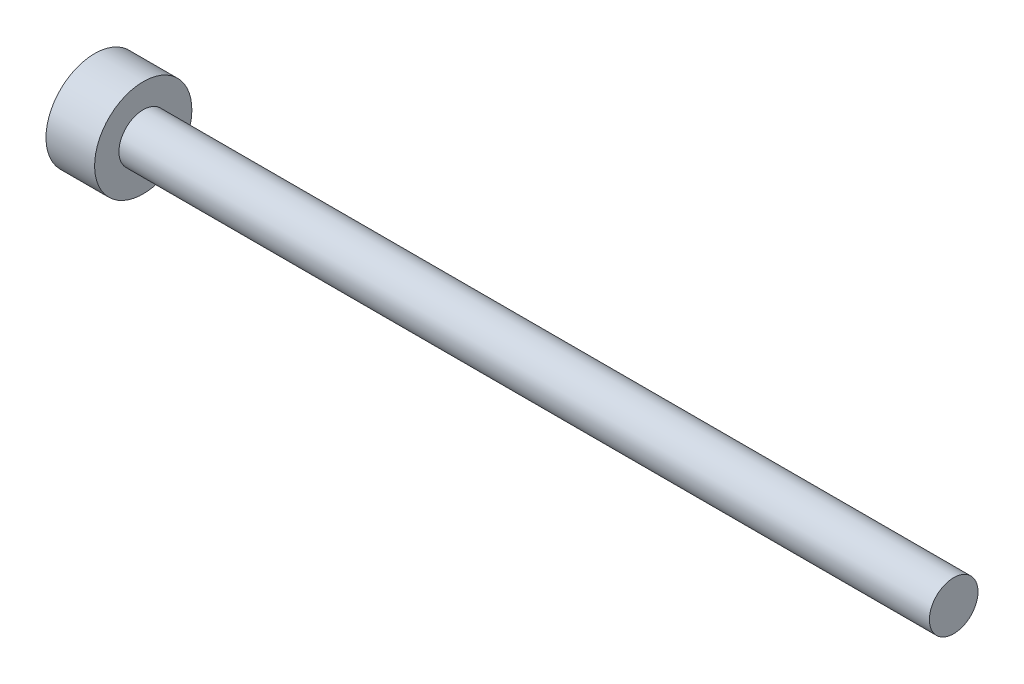
ISO-10303-21;
HEADER;
FILE_DESCRIPTION(('STEP AP214'),'2;1');
FILE_NAME('part.step','',(''),(''),'','','');
FILE_SCHEMA(('AUTOMOTIVE_DESIGN { 1 0 10303 214 1 1 1 1 }'));
ENDSEC;
DATA;
#1=APPLICATION_CONTEXT('core data for automotive mechanical design processes');
#2=APPLICATION_PROTOCOL_DEFINITION('international standard','automotive_design',2000,#1);
#3=PRODUCT_CONTEXT('',#1,'mechanical');
#4=PRODUCT('Part','Part','',(#3));
#5=PRODUCT_RELATED_PRODUCT_CATEGORY('part','',(#4));
#6=PRODUCT_DEFINITION_FORMATION('','',#4);
#7=PRODUCT_DEFINITION_CONTEXT('part definition',#1,'design');
#8=PRODUCT_DEFINITION('design','',#6,#7);
#9=PRODUCT_DEFINITION_SHAPE('','',#8);
#10=(LENGTH_UNIT() NAMED_UNIT(*) SI_UNIT(.MILLI.,.METRE.));
#11=(NAMED_UNIT(*) PLANE_ANGLE_UNIT() SI_UNIT($,.RADIAN.));
#12=(NAMED_UNIT(*) SI_UNIT($,.STERADIAN.) SOLID_ANGLE_UNIT());
#13=UNCERTAINTY_MEASURE_WITH_UNIT(LENGTH_MEASURE(1.E-05),#10,'distance_accuracy_value','');
#14=(GEOMETRIC_REPRESENTATION_CONTEXT(3) GLOBAL_UNCERTAINTY_ASSIGNED_CONTEXT((#13)) GLOBAL_UNIT_ASSIGNED_CONTEXT((#10,
#11,#12)) REPRESENTATION_CONTEXT('',''));
#15=CARTESIAN_POINT('',(0.,0.,0.));
#16=DIRECTION('',(0.,0.,1.));
#17=DIRECTION('',(1.,0.,0.));
#18=AXIS2_PLACEMENT_3D('',#15,#16,#17);
#19=CARTESIAN_POINT('',(-53.,0.,0.));
#20=DIRECTION('',(1.,0.,0.));
#21=DIRECTION('',(0.,1.,0.));
#22=AXIS2_PLACEMENT_3D('',#19,#20,#21);
#23=PLANE('',#22);
#24=CARTESIAN_POINT('',(-53.,0.,0.));
#25=DIRECTION('',(1.,0.,0.));
#26=DIRECTION('',(0.,1.,0.));
#27=AXIS2_PLACEMENT_3D('',#24,#25,#26);
#28=CIRCLE('',#27,3.);
#29=CARTESIAN_POINT('',(-53.,2.99999999999999,0.));
#30=VERTEX_POINT('',#29);
#31=EDGE_CURVE('E62',#30,#30,#28,.T.);
#32=ORIENTED_EDGE('',*,*,#31,.F.);
#33=EDGE_LOOP('',(#32));
#34=FACE_BOUND('',#33,.T.);
#35=ADVANCED_FACE('F45',(#34),#23,.F.);
#36=CARTESIAN_POINT('',(0.,0.,0.));
#37=DIRECTION('',(1.,0.,0.));
#38=DIRECTION('',(0.,1.,0.));
#39=AXIS2_PLACEMENT_3D('',#36,#37,#38);
#40=PLANE('',#39);
#41=CARTESIAN_POINT('',(0.,0.,0.));
#42=DIRECTION('',(1.,0.,0.));
#43=DIRECTION('',(0.,1.,0.));
#44=AXIS2_PLACEMENT_3D('',#41,#42,#43);
#45=CIRCLE('',#44,1.5);
#46=CARTESIAN_POINT('',(0.,1.5,0.));
#47=VERTEX_POINT('',#46);
#48=EDGE_CURVE('E10',#47,#47,#45,.T.);
#49=ORIENTED_EDGE('',*,*,#48,.T.);
#50=EDGE_LOOP('',(#49));
#51=FACE_BOUND('',#50,.T.);
#52=ADVANCED_FACE('F73',(#51),#40,.T.);
#53=CARTESIAN_POINT('',(0.,0.,0.));
#54=DIRECTION('',(1.,0.,0.));
#55=DIRECTION('',(0.,1.,0.));
#56=AXIS2_PLACEMENT_3D('',#53,#54,#55);
#57=CYLINDRICAL_SURFACE('',#56,1.5);
#58=CARTESIAN_POINT('',(-50.,0.,0.));
#59=DIRECTION('',(1.,0.,0.));
#60=DIRECTION('',(0.,1.,0.));
#61=AXIS2_PLACEMENT_3D('',#58,#59,#60);
#62=CIRCLE('',#61,1.5);
#63=CARTESIAN_POINT('',(-50.,1.49999999999999,0.));
#64=VERTEX_POINT('',#63);
#65=EDGE_CURVE('E52',#64,#64,#62,.T.);
#66=ORIENTED_EDGE('',*,*,#65,.T.);
#67=EDGE_LOOP('',(#66));
#68=FACE_BOUND('',#67,.T.);
#69=ORIENTED_EDGE('',*,*,#48,.F.);
#70=EDGE_LOOP('',(#69));
#71=FACE_BOUND('',#70,.T.);
#72=ADVANCED_FACE('F77',(#68,#71),#57,.T.);
#73=CARTESIAN_POINT('',(-50.,0.,0.));
#74=DIRECTION('',(1.,0.,0.));
#75=DIRECTION('',(0.,1.,0.));
#76=AXIS2_PLACEMENT_3D('',#73,#74,#75);
#77=PLANE('',#76);
#78=CARTESIAN_POINT('',(-50.,0.,0.));
#79=DIRECTION('',(1.,0.,0.));
#80=DIRECTION('',(0.,1.,0.));
#81=AXIS2_PLACEMENT_3D('',#78,#79,#80);
#82=CIRCLE('',#81,3.);
#83=CARTESIAN_POINT('',(-50.,2.99999999999999,0.));
#84=VERTEX_POINT('',#83);
#85=EDGE_CURVE('E57',#84,#84,#82,.T.);
#86=ORIENTED_EDGE('',*,*,#85,.T.);
#87=EDGE_LOOP('',(#86));
#88=FACE_BOUND('',#87,.T.);
#89=ORIENTED_EDGE('',*,*,#65,.F.);
#90=EDGE_LOOP('',(#89));
#91=FACE_BOUND('',#90,.T.);
#92=ADVANCED_FACE('F81',(#88,#91),#77,.T.);
#93=CARTESIAN_POINT('',(0.,0.,0.));
#94=DIRECTION('',(1.,0.,0.));
#95=DIRECTION('',(0.,1.,0.));
#96=AXIS2_PLACEMENT_3D('',#93,#94,#95);
#97=CYLINDRICAL_SURFACE('',#96,3.);
#98=ORIENTED_EDGE('',*,*,#31,.T.);
#99=EDGE_LOOP('',(#98));
#100=FACE_BOUND('',#99,.T.);
#101=ORIENTED_EDGE('',*,*,#85,.F.);
#102=EDGE_LOOP('',(#101));
#103=FACE_BOUND('',#102,.T.);
#104=ADVANCED_FACE('F69',(#100,#103),#97,.T.);
#105=CLOSED_SHELL('',(#35,#52,#72,#92,#104));
#106=MANIFOLD_SOLID_BREP('B2',#105);
#107=ADVANCED_BREP_SHAPE_REPRESENTATION('',(#18,#106),#14);
#108=SHAPE_DEFINITION_REPRESENTATION(#9,#107);
ENDSEC;
END-ISO-10303-21;
